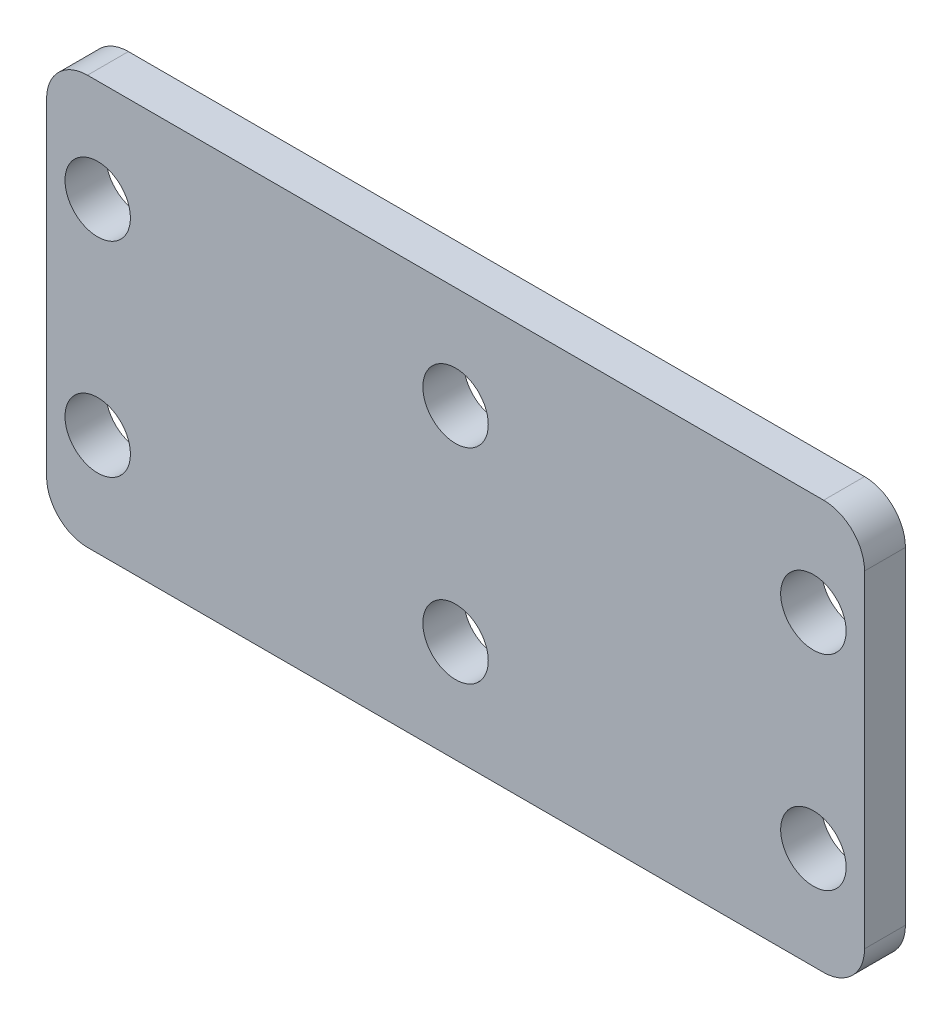
ISO-10303-21;
HEADER;
FILE_DESCRIPTION(('STEP AP214'),'2;1');
FILE_NAME('part.step','',(''),(''),'','','');
FILE_SCHEMA(('AUTOMOTIVE_DESIGN { 1 0 10303 214 1 1 1 1 }'));
ENDSEC;
DATA;
#1=APPLICATION_CONTEXT('core data for automotive mechanical design processes');
#2=APPLICATION_PROTOCOL_DEFINITION('international standard','automotive_design',2000,#1);
#3=PRODUCT_CONTEXT('',#1,'mechanical');
#4=PRODUCT('Part','Part','',(#3));
#5=PRODUCT_RELATED_PRODUCT_CATEGORY('part','',(#4));
#6=PRODUCT_DEFINITION_FORMATION('','',#4);
#7=PRODUCT_DEFINITION_CONTEXT('part definition',#1,'design');
#8=PRODUCT_DEFINITION('design','',#6,#7);
#9=PRODUCT_DEFINITION_SHAPE('','',#8);
#10=(LENGTH_UNIT() NAMED_UNIT(*) SI_UNIT(.MILLI.,.METRE.));
#11=(NAMED_UNIT(*) PLANE_ANGLE_UNIT() SI_UNIT($,.RADIAN.));
#12=(NAMED_UNIT(*) SI_UNIT($,.STERADIAN.) SOLID_ANGLE_UNIT());
#13=UNCERTAINTY_MEASURE_WITH_UNIT(LENGTH_MEASURE(1.E-05),#10,'distance_accuracy_value','');
#14=(GEOMETRIC_REPRESENTATION_CONTEXT(3) GLOBAL_UNCERTAINTY_ASSIGNED_CONTEXT((#13)) GLOBAL_UNIT_ASSIGNED_CONTEXT((#10,
#11,#12)) REPRESENTATION_CONTEXT('',''));
#15=CARTESIAN_POINT('',(0.,0.,0.));
#16=DIRECTION('',(0.,0.,1.));
#17=DIRECTION('',(1.,0.,0.));
#18=AXIS2_PLACEMENT_3D('',#15,#16,#17);
#19=CARTESIAN_POINT('',(20.,10.,2.));
#20=DIRECTION('',(-1.,0.,0.));
#21=DIRECTION('',(0.,-1.,0.));
#22=AXIS2_PLACEMENT_3D('',#19,#20,#21);
#23=PLANE('',#22);
#24=DIRECTION('',(0.,1.,0.));
#25=VECTOR('',#24,1.);
#26=CARTESIAN_POINT('',(20.,10.,2.));
#27=LINE('',#26,#25);
#28=CARTESIAN_POINT('',(20.,-8.,2.));
#29=VERTEX_POINT('',#28);
#30=CARTESIAN_POINT('',(20.,8.,2.));
#31=VERTEX_POINT('',#30);
#32=EDGE_CURVE('E119',#29,#31,#27,.T.);
#33=ORIENTED_EDGE('',*,*,#32,.F.);
#34=DIRECTION('',(0.,0.,-1.));
#35=VECTOR('',#34,1.);
#36=CARTESIAN_POINT('',(20.,-8.,2.));
#37=LINE('',#36,#35);
#38=CARTESIAN_POINT('',(20.,-8.,0.));
#39=VERTEX_POINT('',#38);
#40=EDGE_CURVE('E104',#29,#39,#37,.T.);
#41=ORIENTED_EDGE('',*,*,#40,.T.);
#42=DIRECTION('',(0.,1.,0.));
#43=VECTOR('',#42,1.);
#44=CARTESIAN_POINT('',(20.,10.,0.));
#45=LINE('',#44,#43);
#46=CARTESIAN_POINT('',(20.,8.,0.));
#47=VERTEX_POINT('',#46);
#48=EDGE_CURVE('E116',#39,#47,#45,.T.);
#49=ORIENTED_EDGE('',*,*,#48,.T.);
#50=DIRECTION('',(0.,0.,-1.));
#51=VECTOR('',#50,1.);
#52=CARTESIAN_POINT('',(20.,8.,2.));
#53=LINE('',#52,#51);
#54=EDGE_CURVE('E121',#47,#31,#53,.F.);
#55=ORIENTED_EDGE('',*,*,#54,.T.);
#56=EDGE_LOOP('',(#33,#41,#49,#55));
#57=FACE_BOUND('',#56,.T.);
#58=ADVANCED_FACE('F33',(#57),#23,.F.);
#59=CARTESIAN_POINT('',(-20.,10.,2.));
#60=DIRECTION('',(0.,-1.,0.));
#61=DIRECTION('',(0.,0.,-1.));
#62=AXIS2_PLACEMENT_3D('',#59,#60,#61);
#63=PLANE('',#62);
#64=DIRECTION('',(-1.,0.,0.));
#65=VECTOR('',#64,1.);
#66=CARTESIAN_POINT('',(-20.,10.,2.));
#67=LINE('',#66,#65);
#68=CARTESIAN_POINT('',(18.,10.,2.));
#69=VERTEX_POINT('',#68);
#70=CARTESIAN_POINT('',(-18.,10.,2.));
#71=VERTEX_POINT('',#70);
#72=EDGE_CURVE('E163',#69,#71,#67,.T.);
#73=ORIENTED_EDGE('',*,*,#72,.F.);
#74=DIRECTION('',(0.,0.,-1.));
#75=VECTOR('',#74,1.);
#76=CARTESIAN_POINT('',(18.,10.,2.));
#77=LINE('',#76,#75);
#78=CARTESIAN_POINT('',(18.,10.,0.));
#79=VERTEX_POINT('',#78);
#80=EDGE_CURVE('E11',#69,#79,#77,.T.);
#81=ORIENTED_EDGE('',*,*,#80,.T.);
#82=DIRECTION('',(-1.,0.,0.));
#83=VECTOR('',#82,1.);
#84=CARTESIAN_POINT('',(-20.,10.,0.));
#85=LINE('',#84,#83);
#86=CARTESIAN_POINT('',(-18.,10.,0.));
#87=VERTEX_POINT('',#86);
#88=EDGE_CURVE('E126',#79,#87,#85,.T.);
#89=ORIENTED_EDGE('',*,*,#88,.T.);
#90=DIRECTION('',(0.,0.,-1.));
#91=VECTOR('',#90,1.);
#92=CARTESIAN_POINT('',(-18.,10.,2.));
#93=LINE('',#92,#91);
#94=EDGE_CURVE('E41',#87,#71,#93,.F.);
#95=ORIENTED_EDGE('',*,*,#94,.T.);
#96=EDGE_LOOP('',(#73,#81,#89,#95));
#97=FACE_BOUND('',#96,.T.);
#98=ADVANCED_FACE('F162',(#97),#63,.F.);
#99=CARTESIAN_POINT('',(-20.,10.,2.));
#100=DIRECTION('',(1.,0.,0.));
#101=DIRECTION('',(0.,0.,-1.));
#102=AXIS2_PLACEMENT_3D('',#99,#100,#101);
#103=PLANE('',#102);
#104=DIRECTION('',(0.,-1.,0.));
#105=VECTOR('',#104,1.);
#106=CARTESIAN_POINT('',(-20.,10.,0.));
#107=LINE('',#106,#105);
#108=CARTESIAN_POINT('',(-20.,8.,0.));
#109=VERTEX_POINT('',#108);
#110=CARTESIAN_POINT('',(-20.,-8.,0.));
#111=VERTEX_POINT('',#110);
#112=EDGE_CURVE('E130',#109,#111,#107,.T.);
#113=ORIENTED_EDGE('',*,*,#112,.T.);
#114=DIRECTION('',(0.,0.,-1.));
#115=VECTOR('',#114,1.);
#116=CARTESIAN_POINT('',(-20.,-8.,2.));
#117=LINE('',#116,#115);
#118=CARTESIAN_POINT('',(-20.,-8.,2.));
#119=VERTEX_POINT('',#118);
#120=EDGE_CURVE('E48',#111,#119,#117,.F.);
#121=ORIENTED_EDGE('',*,*,#120,.T.);
#122=DIRECTION('',(0.,-1.,0.));
#123=VECTOR('',#122,1.);
#124=CARTESIAN_POINT('',(-20.,10.,2.));
#125=LINE('',#124,#123);
#126=CARTESIAN_POINT('',(-20.,8.,2.));
#127=VERTEX_POINT('',#126);
#128=EDGE_CURVE('E169',#127,#119,#125,.T.);
#129=ORIENTED_EDGE('',*,*,#128,.F.);
#130=DIRECTION('',(0.,0.,-1.));
#131=VECTOR('',#130,1.);
#132=CARTESIAN_POINT('',(-20.,8.,2.));
#133=LINE('',#132,#131);
#134=EDGE_CURVE('E156',#127,#109,#133,.T.);
#135=ORIENTED_EDGE('',*,*,#134,.T.);
#136=EDGE_LOOP('',(#113,#121,#129,#135));
#137=FACE_BOUND('',#136,.T.);
#138=ADVANCED_FACE('F173',(#137),#103,.F.);
#139=CARTESIAN_POINT('',(-20.,-10.,2.));
#140=DIRECTION('',(0.,1.,0.));
#141=DIRECTION('',(0.,0.,1.));
#142=AXIS2_PLACEMENT_3D('',#139,#140,#141);
#143=PLANE('',#142);
#144=DIRECTION('',(1.,0.,0.));
#145=VECTOR('',#144,1.);
#146=CARTESIAN_POINT('',(-20.,-10.,0.));
#147=LINE('',#146,#145);
#148=CARTESIAN_POINT('',(-18.,-10.,0.));
#149=VERTEX_POINT('',#148);
#150=CARTESIAN_POINT('',(18.,-10.,0.));
#151=VERTEX_POINT('',#150);
#152=EDGE_CURVE('E140',#149,#151,#147,.T.);
#153=ORIENTED_EDGE('',*,*,#152,.T.);
#154=DIRECTION('',(0.,0.,-1.));
#155=VECTOR('',#154,1.);
#156=CARTESIAN_POINT('',(18.,-10.,2.));
#157=LINE('',#156,#155);
#158=CARTESIAN_POINT('',(18.,-10.,2.));
#159=VERTEX_POINT('',#158);
#160=EDGE_CURVE('E105',#151,#159,#157,.F.);
#161=ORIENTED_EDGE('',*,*,#160,.T.);
#162=DIRECTION('',(1.,0.,0.));
#163=VECTOR('',#162,1.);
#164=CARTESIAN_POINT('',(-20.,-10.,2.));
#165=LINE('',#164,#163);
#166=CARTESIAN_POINT('',(-18.,-10.,2.));
#167=VERTEX_POINT('',#166);
#168=EDGE_CURVE('E136',#167,#159,#165,.T.);
#169=ORIENTED_EDGE('',*,*,#168,.F.);
#170=DIRECTION('',(0.,0.,-1.));
#171=VECTOR('',#170,1.);
#172=CARTESIAN_POINT('',(-18.,-10.,2.));
#173=LINE('',#172,#171);
#174=EDGE_CURVE('E110',#167,#149,#173,.T.);
#175=ORIENTED_EDGE('',*,*,#174,.T.);
#176=EDGE_LOOP('',(#153,#161,#169,#175));
#177=FACE_BOUND('',#176,.T.);
#178=ADVANCED_FACE('F180',(#177),#143,.F.);
#179=CARTESIAN_POINT('',(0.,0.,2.));
#180=DIRECTION('',(0.,0.,1.));
#181=DIRECTION('',(1.,0.,0.));
#182=AXIS2_PLACEMENT_3D('',#179,#180,#181);
#183=PLANE('',#182);
#184=CARTESIAN_POINT('',(17.5,-5.,2.));
#185=DIRECTION('',(0.,0.,1.));
#186=DIRECTION('',(1.,0.,0.));
#187=AXIS2_PLACEMENT_3D('',#184,#185,#186);
#188=CIRCLE('',#187,1.59999999999999);
#189=CARTESIAN_POINT('',(19.1,-5.,2.));
#190=VERTEX_POINT('',#189);
#191=EDGE_CURVE('E212',#190,#190,#188,.T.);
#192=ORIENTED_EDGE('',*,*,#191,.F.);
#193=EDGE_LOOP('',(#192));
#194=FACE_BOUND('',#193,.T.);
#195=CARTESIAN_POINT('',(-17.5,5.,2.));
#196=DIRECTION('',(0.,0.,1.));
#197=DIRECTION('',(1.,0.,0.));
#198=AXIS2_PLACEMENT_3D('',#195,#196,#197);
#199=CIRCLE('',#198,1.59999999999999);
#200=CARTESIAN_POINT('',(-15.9,5.,2.));
#201=VERTEX_POINT('',#200);
#202=EDGE_CURVE('E206',#201,#201,#199,.T.);
#203=ORIENTED_EDGE('',*,*,#202,.F.);
#204=EDGE_LOOP('',(#203));
#205=FACE_BOUND('',#204,.T.);
#206=CARTESIAN_POINT('',(-17.5,-5.,2.));
#207=DIRECTION('',(0.,0.,1.));
#208=DIRECTION('',(1.,0.,0.));
#209=AXIS2_PLACEMENT_3D('',#206,#207,#208);
#210=CIRCLE('',#209,1.59999999999999);
#211=CARTESIAN_POINT('',(-15.9,-5.,2.));
#212=VERTEX_POINT('',#211);
#213=EDGE_CURVE('E200',#212,#212,#210,.T.);
#214=ORIENTED_EDGE('',*,*,#213,.F.);
#215=EDGE_LOOP('',(#214));
#216=FACE_BOUND('',#215,.T.);
#217=CARTESIAN_POINT('',(17.5,5.,2.));
#218=DIRECTION('',(0.,0.,1.));
#219=DIRECTION('',(1.,0.,0.));
#220=AXIS2_PLACEMENT_3D('',#217,#218,#219);
#221=CIRCLE('',#220,1.59999999999999);
#222=CARTESIAN_POINT('',(19.1,5.,2.));
#223=VERTEX_POINT('',#222);
#224=EDGE_CURVE('E194',#223,#223,#221,.T.);
#225=ORIENTED_EDGE('',*,*,#224,.F.);
#226=EDGE_LOOP('',(#225));
#227=FACE_BOUND('',#226,.T.);
#228=CARTESIAN_POINT('',(0.,5.,2.));
#229=DIRECTION('',(0.,0.,1.));
#230=DIRECTION('',(1.,0.,0.));
#231=AXIS2_PLACEMENT_3D('',#228,#229,#230);
#232=CIRCLE('',#231,1.59999999999999);
#233=CARTESIAN_POINT('',(1.59999999999998,5.,2.));
#234=VERTEX_POINT('',#233);
#235=EDGE_CURVE('E188',#234,#234,#232,.T.);
#236=ORIENTED_EDGE('',*,*,#235,.F.);
#237=EDGE_LOOP('',(#236));
#238=FACE_BOUND('',#237,.T.);
#239=CARTESIAN_POINT('',(0.,-5.,2.));
#240=DIRECTION('',(0.,0.,1.));
#241=DIRECTION('',(1.,0.,0.));
#242=AXIS2_PLACEMENT_3D('',#239,#240,#241);
#243=CIRCLE('',#242,1.59999999999999);
#244=CARTESIAN_POINT('',(1.59999999999998,-5.,2.));
#245=VERTEX_POINT('',#244);
#246=EDGE_CURVE('E133',#245,#245,#243,.T.);
#247=ORIENTED_EDGE('',*,*,#246,.F.);
#248=EDGE_LOOP('',(#247));
#249=FACE_BOUND('',#248,.T.);
#250=ORIENTED_EDGE('',*,*,#168,.T.);
#251=CARTESIAN_POINT('',(18.,-8.,2.));
#252=DIRECTION('',(0.,0.,1.));
#253=DIRECTION('',(1.,0.,0.));
#254=AXIS2_PLACEMENT_3D('',#251,#252,#253);
#255=CIRCLE('',#254,2.);
#256=EDGE_CURVE('E154',#159,#29,#255,.T.);
#257=ORIENTED_EDGE('',*,*,#256,.T.);
#258=ORIENTED_EDGE('',*,*,#32,.T.);
#259=CARTESIAN_POINT('',(18.,8.,2.));
#260=DIRECTION('',(0.,0.,1.));
#261=DIRECTION('',(1.,0.,0.));
#262=AXIS2_PLACEMENT_3D('',#259,#260,#261);
#263=CIRCLE('',#262,2.);
#264=EDGE_CURVE('E150',#31,#69,#263,.T.);
#265=ORIENTED_EDGE('',*,*,#264,.T.);
#266=ORIENTED_EDGE('',*,*,#72,.T.);
#267=CARTESIAN_POINT('',(-18.,8.,2.));
#268=DIRECTION('',(0.,0.,1.));
#269=DIRECTION('',(1.,0.,0.));
#270=AXIS2_PLACEMENT_3D('',#267,#268,#269);
#271=CIRCLE('',#270,2.);
#272=EDGE_CURVE('E55',#71,#127,#271,.T.);
#273=ORIENTED_EDGE('',*,*,#272,.T.);
#274=ORIENTED_EDGE('',*,*,#128,.T.);
#275=CARTESIAN_POINT('',(-18.,-8.,2.));
#276=DIRECTION('',(0.,0.,1.));
#277=DIRECTION('',(1.,0.,0.));
#278=AXIS2_PLACEMENT_3D('',#275,#276,#277);
#279=CIRCLE('',#278,2.);
#280=EDGE_CURVE('E152',#119,#167,#279,.T.);
#281=ORIENTED_EDGE('',*,*,#280,.T.);
#282=EDGE_LOOP('',(#250,#257,#258,#265,#266,#273,#274,#281));
#283=FACE_BOUND('',#282,.T.);
#284=ADVANCED_FACE('F167',(#194,#205,#216,#227,#238,#249,#283),#183,.T.);
#285=CARTESIAN_POINT('',(0.,0.,0.));
#286=DIRECTION('',(0.,0.,1.));
#287=DIRECTION('',(1.,0.,0.));
#288=AXIS2_PLACEMENT_3D('',#285,#286,#287);
#289=PLANE('',#288);
#290=CARTESIAN_POINT('',(17.5,-5.,0.));
#291=DIRECTION('',(0.,0.,1.));
#292=DIRECTION('',(1.,0.,0.));
#293=AXIS2_PLACEMENT_3D('',#290,#291,#292);
#294=CIRCLE('',#293,1.6);
#295=CARTESIAN_POINT('',(19.1,-5.,0.));
#296=VERTEX_POINT('',#295);
#297=EDGE_CURVE('E209',#296,#296,#294,.T.);
#298=ORIENTED_EDGE('',*,*,#297,.T.);
#299=EDGE_LOOP('',(#298));
#300=FACE_BOUND('',#299,.T.);
#301=CARTESIAN_POINT('',(-17.5,5.,0.));
#302=DIRECTION('',(0.,0.,1.));
#303=DIRECTION('',(1.,0.,0.));
#304=AXIS2_PLACEMENT_3D('',#301,#302,#303);
#305=CIRCLE('',#304,1.6);
#306=CARTESIAN_POINT('',(-15.9,5.,0.));
#307=VERTEX_POINT('',#306);
#308=EDGE_CURVE('E203',#307,#307,#305,.T.);
#309=ORIENTED_EDGE('',*,*,#308,.T.);
#310=EDGE_LOOP('',(#309));
#311=FACE_BOUND('',#310,.T.);
#312=CARTESIAN_POINT('',(-17.5,-5.,0.));
#313=DIRECTION('',(0.,0.,1.));
#314=DIRECTION('',(1.,0.,0.));
#315=AXIS2_PLACEMENT_3D('',#312,#313,#314);
#316=CIRCLE('',#315,1.6);
#317=CARTESIAN_POINT('',(-15.9,-5.,0.));
#318=VERTEX_POINT('',#317);
#319=EDGE_CURVE('E197',#318,#318,#316,.T.);
#320=ORIENTED_EDGE('',*,*,#319,.T.);
#321=EDGE_LOOP('',(#320));
#322=FACE_BOUND('',#321,.T.);
#323=CARTESIAN_POINT('',(17.5,5.,0.));
#324=DIRECTION('',(0.,0.,1.));
#325=DIRECTION('',(1.,0.,0.));
#326=AXIS2_PLACEMENT_3D('',#323,#324,#325);
#327=CIRCLE('',#326,1.6);
#328=CARTESIAN_POINT('',(19.1,5.,0.));
#329=VERTEX_POINT('',#328);
#330=EDGE_CURVE('E191',#329,#329,#327,.T.);
#331=ORIENTED_EDGE('',*,*,#330,.T.);
#332=EDGE_LOOP('',(#331));
#333=FACE_BOUND('',#332,.T.);
#334=CARTESIAN_POINT('',(0.,5.,0.));
#335=DIRECTION('',(0.,0.,1.));
#336=DIRECTION('',(1.,0.,0.));
#337=AXIS2_PLACEMENT_3D('',#334,#335,#336);
#338=CIRCLE('',#337,1.6);
#339=CARTESIAN_POINT('',(1.59999999999999,5.,0.));
#340=VERTEX_POINT('',#339);
#341=EDGE_CURVE('E185',#340,#340,#338,.T.);
#342=ORIENTED_EDGE('',*,*,#341,.T.);
#343=EDGE_LOOP('',(#342));
#344=FACE_BOUND('',#343,.T.);
#345=CARTESIAN_POINT('',(0.,-5.,0.));
#346=DIRECTION('',(0.,0.,1.));
#347=DIRECTION('',(1.,0.,0.));
#348=AXIS2_PLACEMENT_3D('',#345,#346,#347);
#349=CIRCLE('',#348,1.6);
#350=CARTESIAN_POINT('',(1.59999999999999,-5.,0.));
#351=VERTEX_POINT('',#350);
#352=EDGE_CURVE('E127',#351,#351,#349,.T.);
#353=ORIENTED_EDGE('',*,*,#352,.T.);
#354=EDGE_LOOP('',(#353));
#355=FACE_BOUND('',#354,.T.);
#356=ORIENTED_EDGE('',*,*,#48,.F.);
#357=CARTESIAN_POINT('',(18.,-8.,0.));
#358=DIRECTION('',(0.,0.,1.));
#359=DIRECTION('',(1.,0.,0.));
#360=AXIS2_PLACEMENT_3D('',#357,#358,#359);
#361=CIRCLE('',#360,2.);
#362=EDGE_CURVE('E100',#39,#151,#361,.F.);
#363=ORIENTED_EDGE('',*,*,#362,.T.);
#364=ORIENTED_EDGE('',*,*,#152,.F.);
#365=CARTESIAN_POINT('',(-18.,-8.,0.));
#366=DIRECTION('',(0.,0.,1.));
#367=DIRECTION('',(1.,0.,0.));
#368=AXIS2_PLACEMENT_3D('',#365,#366,#367);
#369=CIRCLE('',#368,2.);
#370=EDGE_CURVE('E111',#149,#111,#369,.F.);
#371=ORIENTED_EDGE('',*,*,#370,.T.);
#372=ORIENTED_EDGE('',*,*,#112,.F.);
#373=CARTESIAN_POINT('',(-18.,8.,0.));
#374=DIRECTION('',(0.,0.,1.));
#375=DIRECTION('',(1.,0.,0.));
#376=AXIS2_PLACEMENT_3D('',#373,#374,#375);
#377=CIRCLE('',#376,2.);
#378=EDGE_CURVE('E120',#109,#87,#377,.F.);
#379=ORIENTED_EDGE('',*,*,#378,.T.);
#380=ORIENTED_EDGE('',*,*,#88,.F.);
#381=CARTESIAN_POINT('',(18.,8.,0.));
#382=DIRECTION('',(0.,0.,1.));
#383=DIRECTION('',(1.,0.,0.));
#384=AXIS2_PLACEMENT_3D('',#381,#382,#383);
#385=CIRCLE('',#384,2.);
#386=EDGE_CURVE('E125',#79,#47,#385,.F.);
#387=ORIENTED_EDGE('',*,*,#386,.T.);
#388=EDGE_LOOP('',(#356,#363,#364,#371,#372,#379,#380,#387));
#389=FACE_BOUND('',#388,.T.);
#390=ADVANCED_FACE('F123',(#300,#311,#322,#333,#344,#355,#389),#289,.F.);
#391=CARTESIAN_POINT('',(0.,-5.,2.));
#392=DIRECTION('',(0.,0.,1.));
#393=DIRECTION('',(1.,0.,0.));
#394=AXIS2_PLACEMENT_3D('',#391,#392,#393);
#395=CYLINDRICAL_SURFACE('',#394,1.59999999999999);
#396=ORIENTED_EDGE('',*,*,#352,.F.);
#397=EDGE_LOOP('',(#396));
#398=FACE_BOUND('',#397,.T.);
#399=ORIENTED_EDGE('',*,*,#246,.T.);
#400=EDGE_LOOP('',(#399));
#401=FACE_BOUND('',#400,.T.);
#402=ADVANCED_FACE('F231',(#398,#401),#395,.F.);
#403=CARTESIAN_POINT('',(0.,5.,2.));
#404=DIRECTION('',(0.,0.,1.));
#405=DIRECTION('',(1.,0.,0.));
#406=AXIS2_PLACEMENT_3D('',#403,#404,#405);
#407=CYLINDRICAL_SURFACE('',#406,1.59999999999999);
#408=ORIENTED_EDGE('',*,*,#341,.F.);
#409=EDGE_LOOP('',(#408));
#410=FACE_BOUND('',#409,.T.);
#411=ORIENTED_EDGE('',*,*,#235,.T.);
#412=EDGE_LOOP('',(#411));
#413=FACE_BOUND('',#412,.T.);
#414=ADVANCED_FACE('F233',(#410,#413),#407,.F.);
#415=CARTESIAN_POINT('',(17.5,5.,2.));
#416=DIRECTION('',(0.,0.,1.));
#417=DIRECTION('',(1.,0.,0.));
#418=AXIS2_PLACEMENT_3D('',#415,#416,#417);
#419=CYLINDRICAL_SURFACE('',#418,1.59999999999999);
#420=ORIENTED_EDGE('',*,*,#330,.F.);
#421=EDGE_LOOP('',(#420));
#422=FACE_BOUND('',#421,.T.);
#423=ORIENTED_EDGE('',*,*,#224,.T.);
#424=EDGE_LOOP('',(#423));
#425=FACE_BOUND('',#424,.T.);
#426=ADVANCED_FACE('F240',(#422,#425),#419,.F.);
#427=CARTESIAN_POINT('',(-17.5,-5.,2.));
#428=DIRECTION('',(0.,0.,1.));
#429=DIRECTION('',(1.,0.,0.));
#430=AXIS2_PLACEMENT_3D('',#427,#428,#429);
#431=CYLINDRICAL_SURFACE('',#430,1.59999999999999);
#432=ORIENTED_EDGE('',*,*,#319,.F.);
#433=EDGE_LOOP('',(#432));
#434=FACE_BOUND('',#433,.T.);
#435=ORIENTED_EDGE('',*,*,#213,.T.);
#436=EDGE_LOOP('',(#435));
#437=FACE_BOUND('',#436,.T.);
#438=ADVANCED_FACE('F340',(#434,#437),#431,.F.);
#439=CARTESIAN_POINT('',(-17.5,5.,2.));
#440=DIRECTION('',(0.,0.,1.));
#441=DIRECTION('',(1.,0.,0.));
#442=AXIS2_PLACEMENT_3D('',#439,#440,#441);
#443=CYLINDRICAL_SURFACE('',#442,1.59999999999999);
#444=ORIENTED_EDGE('',*,*,#308,.F.);
#445=EDGE_LOOP('',(#444));
#446=FACE_BOUND('',#445,.T.);
#447=ORIENTED_EDGE('',*,*,#202,.T.);
#448=EDGE_LOOP('',(#447));
#449=FACE_BOUND('',#448,.T.);
#450=ADVANCED_FACE('F349',(#446,#449),#443,.F.);
#451=CARTESIAN_POINT('',(17.5,-5.,2.));
#452=DIRECTION('',(0.,0.,1.));
#453=DIRECTION('',(1.,0.,0.));
#454=AXIS2_PLACEMENT_3D('',#451,#452,#453);
#455=CYLINDRICAL_SURFACE('',#454,1.59999999999999);
#456=ORIENTED_EDGE('',*,*,#297,.F.);
#457=EDGE_LOOP('',(#456));
#458=FACE_BOUND('',#457,.T.);
#459=ORIENTED_EDGE('',*,*,#191,.T.);
#460=EDGE_LOOP('',(#459));
#461=FACE_BOUND('',#460,.T.);
#462=ADVANCED_FACE('F216',(#458,#461),#455,.F.);
#463=CARTESIAN_POINT('',(18.,-8.,2.));
#464=DIRECTION('',(0.,0.,-1.));
#465=DIRECTION('',(-1.,0.,0.));
#466=AXIS2_PLACEMENT_3D('',#463,#464,#465);
#467=CYLINDRICAL_SURFACE('',#466,2.);
#468=ORIENTED_EDGE('',*,*,#256,.F.);
#469=ORIENTED_EDGE('',*,*,#160,.F.);
#470=ORIENTED_EDGE('',*,*,#362,.F.);
#471=ORIENTED_EDGE('',*,*,#40,.F.);
#472=EDGE_LOOP('',(#468,#469,#470,#471));
#473=FACE_BOUND('',#472,.T.);
#474=ADVANCED_FACE('F103',(#473),#467,.T.);
#475=CARTESIAN_POINT('',(-18.,-8.,2.));
#476=DIRECTION('',(0.,0.,-1.));
#477=DIRECTION('',(-1.,0.,0.));
#478=AXIS2_PLACEMENT_3D('',#475,#476,#477);
#479=CYLINDRICAL_SURFACE('',#478,2.);
#480=ORIENTED_EDGE('',*,*,#280,.F.);
#481=ORIENTED_EDGE('',*,*,#120,.F.);
#482=ORIENTED_EDGE('',*,*,#370,.F.);
#483=ORIENTED_EDGE('',*,*,#174,.F.);
#484=EDGE_LOOP('',(#480,#481,#482,#483));
#485=FACE_BOUND('',#484,.T.);
#486=ADVANCED_FACE('F177',(#485),#479,.T.);
#487=CARTESIAN_POINT('',(18.,8.,2.));
#488=DIRECTION('',(0.,0.,-1.));
#489=DIRECTION('',(-1.,0.,0.));
#490=AXIS2_PLACEMENT_3D('',#487,#488,#489);
#491=CYLINDRICAL_SURFACE('',#490,2.);
#492=ORIENTED_EDGE('',*,*,#264,.F.);
#493=ORIENTED_EDGE('',*,*,#54,.F.);
#494=ORIENTED_EDGE('',*,*,#386,.F.);
#495=ORIENTED_EDGE('',*,*,#80,.F.);
#496=EDGE_LOOP('',(#492,#493,#494,#495));
#497=FACE_BOUND('',#496,.T.);
#498=ADVANCED_FACE('F259',(#497),#491,.T.);
#499=CARTESIAN_POINT('',(-18.,8.,2.));
#500=DIRECTION('',(0.,0.,-1.));
#501=DIRECTION('',(-1.,0.,0.));
#502=AXIS2_PLACEMENT_3D('',#499,#500,#501);
#503=CYLINDRICAL_SURFACE('',#502,2.);
#504=ORIENTED_EDGE('',*,*,#272,.F.);
#505=ORIENTED_EDGE('',*,*,#94,.F.);
#506=ORIENTED_EDGE('',*,*,#378,.F.);
#507=ORIENTED_EDGE('',*,*,#134,.F.);
#508=EDGE_LOOP('',(#504,#505,#506,#507));
#509=FACE_BOUND('',#508,.T.);
#510=ADVANCED_FACE('F35',(#509),#503,.T.);
#511=CLOSED_SHELL('',(#58,#98,#138,#178,#284,#390,#402,#414,#426,#438,#450,#462,#474,#486,#498,#510));
#512=MANIFOLD_SOLID_BREP('B2',#511);
#513=ADVANCED_BREP_SHAPE_REPRESENTATION('',(#18,#512),#14);
#514=SHAPE_DEFINITION_REPRESENTATION(#9,#513);
ENDSEC;
END-ISO-10303-21;
